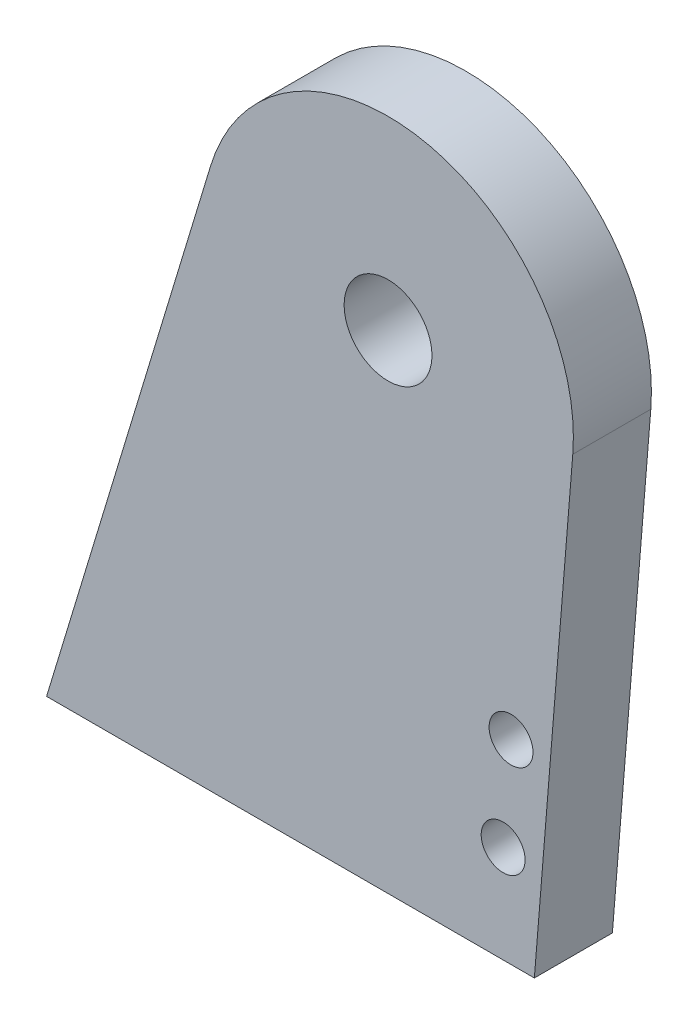
ISO-10303-21;
HEADER;
FILE_DESCRIPTION(('STEP AP214'),'2;1');
FILE_NAME('part.step','',(''),(''),'','','');
FILE_SCHEMA(('AUTOMOTIVE_DESIGN { 1 0 10303 214 1 1 1 1 }'));
ENDSEC;
DATA;
#1=APPLICATION_CONTEXT('core data for automotive mechanical design processes');
#2=APPLICATION_PROTOCOL_DEFINITION('international standard','automotive_design',2000,#1);
#3=PRODUCT_CONTEXT('',#1,'mechanical');
#4=PRODUCT('Part','Part','',(#3));
#5=PRODUCT_RELATED_PRODUCT_CATEGORY('part','',(#4));
#6=PRODUCT_DEFINITION_FORMATION('','',#4);
#7=PRODUCT_DEFINITION_CONTEXT('part definition',#1,'design');
#8=PRODUCT_DEFINITION('design','',#6,#7);
#9=PRODUCT_DEFINITION_SHAPE('','',#8);
#10=(LENGTH_UNIT() NAMED_UNIT(*) SI_UNIT(.MILLI.,.METRE.));
#11=(NAMED_UNIT(*) PLANE_ANGLE_UNIT() SI_UNIT($,.RADIAN.));
#12=(NAMED_UNIT(*) SI_UNIT($,.STERADIAN.) SOLID_ANGLE_UNIT());
#13=UNCERTAINTY_MEASURE_WITH_UNIT(LENGTH_MEASURE(1.E-05),#10,'distance_accuracy_value','');
#14=(GEOMETRIC_REPRESENTATION_CONTEXT(3) GLOBAL_UNCERTAINTY_ASSIGNED_CONTEXT((#13)) GLOBAL_UNIT_ASSIGNED_CONTEXT((#10,
#11,#12)) REPRESENTATION_CONTEXT('',''));
#15=CARTESIAN_POINT('',(0.,0.,0.));
#16=DIRECTION('',(0.,0.,1.));
#17=DIRECTION('',(1.,0.,0.));
#18=AXIS2_PLACEMENT_3D('',#15,#16,#17);
#19=CARTESIAN_POINT('',(49.6720681360177,-4.03597000629349,8.));
#20=DIRECTION('',(-0.99671528668941,0.0809854139931767,0.));
#21=DIRECTION('',(-0.0809854139931767,-0.996715286689411,0.));
#22=AXIS2_PLACEMENT_3D('',#19,#20,#21);
#23=PLANE('',#22);
#24=DIRECTION('',(0.0809854139931767,0.996715286689411,0.));
#25=VECTOR('',#24,1.);
#26=CARTESIAN_POINT('',(49.6720681360177,-4.03597000629349,0.));
#27=LINE('',#26,#25);
#28=CARTESIAN_POINT('',(50.,0.,0.));
#29=VERTEX_POINT('',#28);
#30=CARTESIAN_POINT('',(53.9375904470988,48.4612771341296,0.));
#31=VERTEX_POINT('',#30);
#32=EDGE_CURVE('E129',#29,#31,#27,.T.);
#33=ORIENTED_EDGE('',*,*,#32,.T.);
#34=DIRECTION('',(0.,0.,-1.));
#35=VECTOR('',#34,1.);
#36=CARTESIAN_POINT('',(53.9375904470988,48.4612771341296,8.));
#37=LINE('',#36,#35);
#38=CARTESIAN_POINT('',(53.9375904470988,48.4612771341296,8.));
#39=VERTEX_POINT('',#38);
#40=EDGE_CURVE('E11',#39,#31,#37,.T.);
#41=ORIENTED_EDGE('',*,*,#40,.F.);
#42=DIRECTION('',(0.0809854139931767,0.996715286689411,0.));
#43=VECTOR('',#42,1.);
#44=CARTESIAN_POINT('',(49.6720681360177,-4.03597000629349,8.));
#45=LINE('',#44,#43);
#46=CARTESIAN_POINT('',(50.,0.,8.));
#47=VERTEX_POINT('',#46);
#48=EDGE_CURVE('E130',#47,#39,#45,.T.);
#49=ORIENTED_EDGE('',*,*,#48,.F.);
#50=DIRECTION('',(0.,0.,-1.));
#51=VECTOR('',#50,1.);
#52=CARTESIAN_POINT('',(50.,0.,8.));
#53=LINE('',#52,#51);
#54=EDGE_CURVE('E137',#47,#29,#53,.T.);
#55=ORIENTED_EDGE('',*,*,#54,.T.);
#56=EDGE_LOOP('',(#33,#41,#49,#55));
#57=FACE_BOUND('',#56,.T.);
#58=ADVANCED_FACE('F41',(#57),#23,.F.);
#59=CARTESIAN_POINT('',(35.,50.,8.));
#60=DIRECTION('',(0.,0.,-1.));
#61=DIRECTION('',(-1.,0.,0.));
#62=AXIS2_PLACEMENT_3D('',#59,#60,#61);
#63=CYLINDRICAL_SURFACE('',#62,19.);
#64=CARTESIAN_POINT('',(35.,50.,0.));
#65=DIRECTION('',(0.,0.,1.));
#66=DIRECTION('',(1.,0.,0.));
#67=AXIS2_PLACEMENT_3D('',#64,#65,#66);
#68=CIRCLE('',#67,19.);
#69=CARTESIAN_POINT('',(16.8161073825503,55.5087248322148,0.));
#70=VERTEX_POINT('',#69);
#71=EDGE_CURVE('E140',#31,#70,#68,.T.);
#72=ORIENTED_EDGE('',*,*,#71,.T.);
#73=DIRECTION('',(0.,0.,-1.));
#74=VECTOR('',#73,1.);
#75=CARTESIAN_POINT('',(16.8161073825503,55.5087248322148,8.));
#76=LINE('',#75,#74);
#77=CARTESIAN_POINT('',(16.8161073825503,55.5087248322148,8.));
#78=VERTEX_POINT('',#77);
#79=EDGE_CURVE('E49',#78,#70,#76,.T.);
#80=ORIENTED_EDGE('',*,*,#79,.F.);
#81=CARTESIAN_POINT('',(35.,50.,8.));
#82=DIRECTION('',(0.,0.,1.));
#83=DIRECTION('',(1.,0.,0.));
#84=AXIS2_PLACEMENT_3D('',#81,#82,#83);
#85=CIRCLE('',#84,19.);
#86=EDGE_CURVE('E84',#39,#78,#85,.T.);
#87=ORIENTED_EDGE('',*,*,#86,.F.);
#88=ORIENTED_EDGE('',*,*,#40,.T.);
#89=EDGE_LOOP('',(#72,#80,#87,#88));
#90=FACE_BOUND('',#89,.T.);
#91=ADVANCED_FACE('F151',(#90),#63,.T.);
#92=CARTESIAN_POINT('',(0.,0.,8.));
#93=DIRECTION('',(-0.957046979865772,0.28993288590604,0.));
#94=DIRECTION('',(-0.28993288590604,-0.957046979865772,0.));
#95=AXIS2_PLACEMENT_3D('',#92,#93,#94);
#96=PLANE('',#95);
#97=DIRECTION('',(0.28993288590604,0.957046979865772,0.));
#98=VECTOR('',#97,1.);
#99=CARTESIAN_POINT('',(0.,0.,0.));
#100=LINE('',#99,#98);
#101=CARTESIAN_POINT('',(0.,0.,0.));
#102=VERTEX_POINT('',#101);
#103=EDGE_CURVE('E143',#102,#70,#100,.T.);
#104=ORIENTED_EDGE('',*,*,#103,.F.);
#105=DIRECTION('',(0.,0.,-1.));
#106=VECTOR('',#105,1.);
#107=CARTESIAN_POINT('',(0.,0.,8.));
#108=LINE('',#107,#106);
#109=CARTESIAN_POINT('',(0.,0.,8.));
#110=VERTEX_POINT('',#109);
#111=EDGE_CURVE('E74',#110,#102,#108,.T.);
#112=ORIENTED_EDGE('',*,*,#111,.F.);
#113=DIRECTION('',(0.28993288590604,0.957046979865772,0.));
#114=VECTOR('',#113,1.);
#115=CARTESIAN_POINT('',(0.,0.,8.));
#116=LINE('',#115,#114);
#117=EDGE_CURVE('E133',#110,#78,#116,.T.);
#118=ORIENTED_EDGE('',*,*,#117,.T.);
#119=ORIENTED_EDGE('',*,*,#79,.T.);
#120=EDGE_LOOP('',(#104,#112,#118,#119));
#121=FACE_BOUND('',#120,.T.);
#122=ADVANCED_FACE('F150',(#121),#96,.T.);
#123=CARTESIAN_POINT('',(0.,0.,8.));
#124=DIRECTION('',(0.,1.,0.));
#125=DIRECTION('',(0.,0.,1.));
#126=AXIS2_PLACEMENT_3D('',#123,#124,#125);
#127=PLANE('',#126);
#128=CARTESIAN_POINT('',(10.,0.,4.));
#129=DIRECTION('',(0.,-1.,0.));
#130=DIRECTION('',(0.,0.,-1.));
#131=AXIS2_PLACEMENT_3D('',#128,#129,#130);
#132=CIRCLE('',#131,1.525);
#133=CARTESIAN_POINT('',(10.,0.,2.475));
#134=VERTEX_POINT('',#133);
#135=EDGE_CURVE('E108',#134,#134,#132,.T.);
#136=ORIENTED_EDGE('',*,*,#135,.F.);
#137=EDGE_LOOP('',(#136));
#138=FACE_BOUND('',#137,.T.);
#139=CARTESIAN_POINT('',(40.,0.,4.));
#140=DIRECTION('',(0.,-1.,0.));
#141=DIRECTION('',(0.,0.,-1.));
#142=AXIS2_PLACEMENT_3D('',#139,#140,#141);
#143=CIRCLE('',#142,1.525);
#144=CARTESIAN_POINT('',(40.,0.,2.475));
#145=VERTEX_POINT('',#144);
#146=EDGE_CURVE('E101',#145,#145,#143,.T.);
#147=ORIENTED_EDGE('',*,*,#146,.F.);
#148=EDGE_LOOP('',(#147));
#149=FACE_BOUND('',#148,.T.);
#150=DIRECTION('',(1.,0.,0.));
#151=VECTOR('',#150,1.);
#152=CARTESIAN_POINT('',(0.,0.,0.));
#153=LINE('',#152,#151);
#154=EDGE_CURVE('E77',#102,#29,#153,.T.);
#155=ORIENTED_EDGE('',*,*,#154,.T.);
#156=ORIENTED_EDGE('',*,*,#54,.F.);
#157=DIRECTION('',(1.,0.,0.));
#158=VECTOR('',#157,1.);
#159=CARTESIAN_POINT('',(0.,0.,8.));
#160=LINE('',#159,#158);
#161=EDGE_CURVE('E57',#110,#47,#160,.T.);
#162=ORIENTED_EDGE('',*,*,#161,.F.);
#163=ORIENTED_EDGE('',*,*,#111,.T.);
#164=EDGE_LOOP('',(#155,#156,#162,#163));
#165=FACE_BOUND('',#164,.T.);
#166=ADVANCED_FACE('F158',(#138,#149,#165),#127,.F.);
#167=CARTESIAN_POINT('',(0.,0.,8.));
#168=DIRECTION('',(0.,0.,1.));
#169=DIRECTION('',(1.,0.,0.));
#170=AXIS2_PLACEMENT_3D('',#167,#168,#169);
#171=PLANE('',#170);
#172=CARTESIAN_POINT('',(35.,50.,8.));
#173=DIRECTION('',(0.,0.,-1.));
#174=DIRECTION('',(-1.,0.,0.));
#175=AXIS2_PLACEMENT_3D('',#172,#173,#174);
#176=CIRCLE('',#175,4.5);
#177=CARTESIAN_POINT('',(30.5,50.,8.));
#178=VERTEX_POINT('',#177);
#179=EDGE_CURVE('E342',#178,#178,#176,.T.);
#180=ORIENTED_EDGE('',*,*,#179,.T.);
#181=EDGE_LOOP('',(#180));
#182=FACE_BOUND('',#181,.T.);
#183=CARTESIAN_POINT('',(46.7993408923582,10.,8.));
#184=DIRECTION('',(0.,0.,1.));
#185=DIRECTION('',(1.,0.,0.));
#186=AXIS2_PLACEMENT_3D('',#183,#184,#185);
#187=CIRCLE('',#186,2.24999999999999);
#188=CARTESIAN_POINT('',(49.0493408923582,10.,8.));
#189=VERTEX_POINT('',#188);
#190=EDGE_CURVE('E117',#189,#189,#187,.T.);
#191=ORIENTED_EDGE('',*,*,#190,.F.);
#192=EDGE_LOOP('',(#191));
#193=FACE_BOUND('',#192,.T.);
#194=CARTESIAN_POINT('',(47.60919503229,19.9671528668941,8.));
#195=DIRECTION('',(0.,0.,1.));
#196=DIRECTION('',(1.,0.,0.));
#197=AXIS2_PLACEMENT_3D('',#194,#195,#196);
#198=CIRCLE('',#197,2.24999999999999);
#199=CARTESIAN_POINT('',(49.85919503229,19.9671528668941,8.));
#200=VERTEX_POINT('',#199);
#201=EDGE_CURVE('E123',#200,#200,#198,.T.);
#202=ORIENTED_EDGE('',*,*,#201,.F.);
#203=EDGE_LOOP('',(#202));
#204=FACE_BOUND('',#203,.T.);
#205=ORIENTED_EDGE('',*,*,#48,.T.);
#206=ORIENTED_EDGE('',*,*,#86,.T.);
#207=ORIENTED_EDGE('',*,*,#117,.F.);
#208=ORIENTED_EDGE('',*,*,#161,.T.);
#209=EDGE_LOOP('',(#205,#206,#207,#208));
#210=FACE_BOUND('',#209,.T.);
#211=ADVANCED_FACE('F159',(#182,#193,#204,#210),#171,.T.);
#212=CARTESIAN_POINT('',(0.,0.,0.));
#213=DIRECTION('',(0.,0.,1.));
#214=DIRECTION('',(1.,0.,0.));
#215=AXIS2_PLACEMENT_3D('',#212,#213,#214);
#216=PLANE('',#215);
#217=CARTESIAN_POINT('',(35.,50.,0.));
#218=DIRECTION('',(0.,0.,-1.));
#219=DIRECTION('',(-1.,0.,0.));
#220=AXIS2_PLACEMENT_3D('',#217,#218,#219);
#221=CIRCLE('',#220,4.49999999999989);
#222=CARTESIAN_POINT('',(30.5000000000001,50.,0.));
#223=VERTEX_POINT('',#222);
#224=EDGE_CURVE('E345',#223,#223,#221,.T.);
#225=ORIENTED_EDGE('',*,*,#224,.F.);
#226=EDGE_LOOP('',(#225));
#227=FACE_BOUND('',#226,.T.);
#228=CARTESIAN_POINT('',(46.7993408923582,10.,0.));
#229=DIRECTION('',(0.,0.,1.));
#230=DIRECTION('',(1.,0.,0.));
#231=AXIS2_PLACEMENT_3D('',#228,#229,#230);
#232=CIRCLE('',#231,2.24999999999999);
#233=CARTESIAN_POINT('',(49.0493408923582,10.,0.));
#234=VERTEX_POINT('',#233);
#235=EDGE_CURVE('E120',#234,#234,#232,.T.);
#236=ORIENTED_EDGE('',*,*,#235,.T.);
#237=EDGE_LOOP('',(#236));
#238=FACE_BOUND('',#237,.T.);
#239=CARTESIAN_POINT('',(47.60919503229,19.9671528668941,0.));
#240=DIRECTION('',(0.,0.,1.));
#241=DIRECTION('',(1.,0.,0.));
#242=AXIS2_PLACEMENT_3D('',#239,#240,#241);
#243=CIRCLE('',#242,2.25);
#244=CARTESIAN_POINT('',(49.85919503229,19.9671528668941,0.));
#245=VERTEX_POINT('',#244);
#246=EDGE_CURVE('E126',#245,#245,#243,.T.);
#247=ORIENTED_EDGE('',*,*,#246,.T.);
#248=EDGE_LOOP('',(#247));
#249=FACE_BOUND('',#248,.T.);
#250=ORIENTED_EDGE('',*,*,#32,.F.);
#251=ORIENTED_EDGE('',*,*,#154,.F.);
#252=ORIENTED_EDGE('',*,*,#103,.T.);
#253=ORIENTED_EDGE('',*,*,#71,.F.);
#254=EDGE_LOOP('',(#250,#251,#252,#253));
#255=FACE_BOUND('',#254,.T.);
#256=ADVANCED_FACE('F155',(#227,#238,#249,#255),#216,.F.);
#257=CARTESIAN_POINT('',(47.60919503229,19.9671528668941,8.));
#258=DIRECTION('',(0.,0.,1.));
#259=DIRECTION('',(1.,0.,0.));
#260=AXIS2_PLACEMENT_3D('',#257,#258,#259);
#261=CYLINDRICAL_SURFACE('',#260,2.25);
#262=ORIENTED_EDGE('',*,*,#246,.F.);
#263=EDGE_LOOP('',(#262));
#264=FACE_BOUND('',#263,.T.);
#265=ORIENTED_EDGE('',*,*,#201,.T.);
#266=EDGE_LOOP('',(#265));
#267=FACE_BOUND('',#266,.T.);
#268=ADVANCED_FACE('F167',(#264,#267),#261,.F.);
#269=CARTESIAN_POINT('',(46.7993408923582,10.,8.));
#270=DIRECTION('',(0.,0.,1.));
#271=DIRECTION('',(1.,0.,0.));
#272=AXIS2_PLACEMENT_3D('',#269,#270,#271);
#273=CYLINDRICAL_SURFACE('',#272,2.24999999999999);
#274=ORIENTED_EDGE('',*,*,#235,.F.);
#275=EDGE_LOOP('',(#274));
#276=FACE_BOUND('',#275,.T.);
#277=ORIENTED_EDGE('',*,*,#190,.T.);
#278=EDGE_LOOP('',(#277));
#279=FACE_BOUND('',#278,.T.);
#280=ADVANCED_FACE('F283',(#276,#279),#273,.F.);
#281=CARTESIAN_POINT('',(40.,8.49999999999999,4.));
#282=DIRECTION('',(0.,-1.,0.));
#283=DIRECTION('',(0.,0.,-1.));
#284=AXIS2_PLACEMENT_3D('',#281,#282,#283);
#285=CONICAL_SURFACE('',#284,1.24999999999999,1.02974425867665);
#286=CARTESIAN_POINT('',(40.,9.25107577378444,4.));
#287=VERTEX_POINT('',#286);
#288=VERTEX_LOOP('',#287);
#289=FACE_BOUND('',#288,.T.);
#290=CARTESIAN_POINT('',(40.,8.49999999999999,4.));
#291=DIRECTION('',(0.,-1.,0.));
#292=DIRECTION('',(0.,0.,-1.));
#293=AXIS2_PLACEMENT_3D('',#290,#291,#292);
#294=CIRCLE('',#293,1.24999999999999);
#295=CARTESIAN_POINT('',(40.,8.49999999999999,2.75000000000001));
#296=VERTEX_POINT('',#295);
#297=EDGE_CURVE('E114',#296,#296,#294,.T.);
#298=ORIENTED_EDGE('',*,*,#297,.T.);
#299=EDGE_LOOP('',(#298));
#300=FACE_BOUND('',#299,.T.);
#301=ADVANCED_FACE('F207',(#289,#300),#285,.F.);
#302=CARTESIAN_POINT('',(40.,0.,4.));
#303=DIRECTION('',(0.,-1.,0.));
#304=DIRECTION('',(0.,0.,-1.));
#305=AXIS2_PLACEMENT_3D('',#302,#303,#304);
#306=CYLINDRICAL_SURFACE('',#305,1.24999999999999);
#307=ORIENTED_EDGE('',*,*,#297,.F.);
#308=EDGE_LOOP('',(#307));
#309=FACE_BOUND('',#308,.T.);
#310=CARTESIAN_POINT('',(40.,0.275000000000001,4.));
#311=DIRECTION('',(0.,-1.,0.));
#312=DIRECTION('',(0.,0.,-1.));
#313=AXIS2_PLACEMENT_3D('',#310,#311,#312);
#314=CIRCLE('',#313,1.25);
#315=CARTESIAN_POINT('',(40.,0.275000000000001,2.75));
#316=VERTEX_POINT('',#315);
#317=EDGE_CURVE('E105',#316,#316,#314,.T.);
#318=ORIENTED_EDGE('',*,*,#317,.T.);
#319=EDGE_LOOP('',(#318));
#320=FACE_BOUND('',#319,.T.);
#321=ADVANCED_FACE('F202',(#309,#320),#306,.F.);
#322=CARTESIAN_POINT('',(40.,0.,4.));
#323=DIRECTION('',(0.,-1.,0.));
#324=DIRECTION('',(0.,0.,-1.));
#325=AXIS2_PLACEMENT_3D('',#322,#323,#324);
#326=CONICAL_SURFACE('',#325,1.525,0.785398163397439);
#327=ORIENTED_EDGE('',*,*,#317,.F.);
#328=EDGE_LOOP('',(#327));
#329=FACE_BOUND('',#328,.T.);
#330=ORIENTED_EDGE('',*,*,#146,.T.);
#331=EDGE_LOOP('',(#330));
#332=FACE_BOUND('',#331,.T.);
#333=ADVANCED_FACE('F95',(#329,#332),#326,.F.);
#334=CARTESIAN_POINT('',(10.,8.49999999999999,4.));
#335=DIRECTION('',(0.,-1.,0.));
#336=DIRECTION('',(0.,0.,-1.));
#337=AXIS2_PLACEMENT_3D('',#334,#335,#336);
#338=CONICAL_SURFACE('',#337,1.24999999999999,1.02974425867665);
#339=CARTESIAN_POINT('',(10.,9.25107577378444,4.));
#340=VERTEX_POINT('',#339);
#341=VERTEX_LOOP('',#340);
#342=FACE_BOUND('',#341,.T.);
#343=CARTESIAN_POINT('',(10.,8.49999999999999,4.));
#344=DIRECTION('',(0.,-1.,0.));
#345=DIRECTION('',(0.,0.,-1.));
#346=AXIS2_PLACEMENT_3D('',#343,#344,#345);
#347=CIRCLE('',#346,1.24999999999999);
#348=CARTESIAN_POINT('',(10.,8.49999999999999,2.75000000000001));
#349=VERTEX_POINT('',#348);
#350=EDGE_CURVE('E99',#349,#349,#347,.T.);
#351=ORIENTED_EDGE('',*,*,#350,.T.);
#352=EDGE_LOOP('',(#351));
#353=FACE_BOUND('',#352,.T.);
#354=ADVANCED_FACE('F91',(#342,#353),#338,.F.);
#355=CARTESIAN_POINT('',(10.,0.,4.));
#356=DIRECTION('',(0.,-1.,0.));
#357=DIRECTION('',(0.,0.,-1.));
#358=AXIS2_PLACEMENT_3D('',#355,#356,#357);
#359=CYLINDRICAL_SURFACE('',#358,1.24999999999999);
#360=ORIENTED_EDGE('',*,*,#350,.F.);
#361=EDGE_LOOP('',(#360));
#362=FACE_BOUND('',#361,.T.);
#363=CARTESIAN_POINT('',(10.,0.275000000000001,4.));
#364=DIRECTION('',(0.,-1.,0.));
#365=DIRECTION('',(0.,0.,-1.));
#366=AXIS2_PLACEMENT_3D('',#363,#364,#365);
#367=CIRCLE('',#366,1.25);
#368=CARTESIAN_POINT('',(10.,0.275000000000001,2.75));
#369=VERTEX_POINT('',#368);
#370=EDGE_CURVE('E102',#369,#369,#367,.T.);
#371=ORIENTED_EDGE('',*,*,#370,.T.);
#372=EDGE_LOOP('',(#371));
#373=FACE_BOUND('',#372,.T.);
#374=ADVANCED_FACE('F94',(#362,#373),#359,.F.);
#375=CARTESIAN_POINT('',(10.,0.,4.));
#376=DIRECTION('',(0.,-1.,0.));
#377=DIRECTION('',(0.,0.,-1.));
#378=AXIS2_PLACEMENT_3D('',#375,#376,#377);
#379=CONICAL_SURFACE('',#378,1.525,0.785398163397445);
#380=ORIENTED_EDGE('',*,*,#370,.F.);
#381=EDGE_LOOP('',(#380));
#382=FACE_BOUND('',#381,.T.);
#383=ORIENTED_EDGE('',*,*,#135,.T.);
#384=EDGE_LOOP('',(#383));
#385=FACE_BOUND('',#384,.T.);
#386=ADVANCED_FACE('F198',(#382,#385),#379,.F.);
#387=CARTESIAN_POINT('',(35.,50.,0.));
#388=DIRECTION('',(0.,0.,-1.));
#389=DIRECTION('',(-1.,0.,0.));
#390=AXIS2_PLACEMENT_3D('',#387,#388,#389);
#391=CYLINDRICAL_SURFACE('',#390,4.49999999999994);
#392=ORIENTED_EDGE('',*,*,#179,.F.);
#393=EDGE_LOOP('',(#392));
#394=FACE_BOUND('',#393,.T.);
#395=ORIENTED_EDGE('',*,*,#224,.T.);
#396=EDGE_LOOP('',(#395));
#397=FACE_BOUND('',#396,.T.);
#398=ADVANCED_FACE('F225',(#394,#397),#391,.F.);
#399=CLOSED_SHELL('',(#58,#91,#122,#166,#211,#256,#268,#280,#301,#321,#333,#354,#374,#386,#398));
#400=MANIFOLD_SOLID_BREP('B2',#399);
#401=ADVANCED_BREP_SHAPE_REPRESENTATION('',(#18,#400),#14);
#402=SHAPE_DEFINITION_REPRESENTATION(#9,#401);
ENDSEC;
END-ISO-10303-21;
